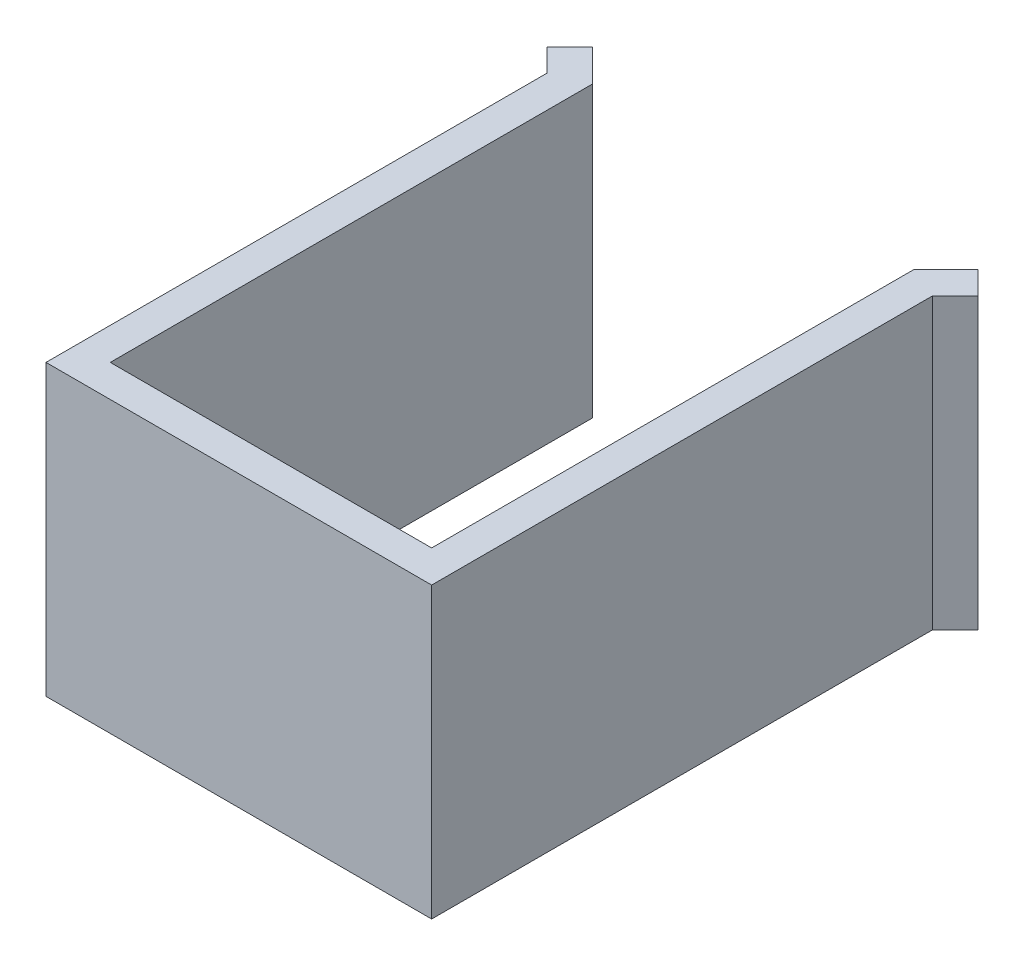
ISO-10303-21;
HEADER;
FILE_DESCRIPTION(('STEP AP214'),'2;1');
FILE_NAME('part.step','',(''),(''),'','','');
FILE_SCHEMA(('AUTOMOTIVE_DESIGN { 1 0 10303 214 1 1 1 1 }'));
ENDSEC;
DATA;
#1=APPLICATION_CONTEXT('core data for automotive mechanical design processes');
#2=APPLICATION_PROTOCOL_DEFINITION('international standard','automotive_design',2000,#1);
#3=PRODUCT_CONTEXT('',#1,'mechanical');
#4=PRODUCT('Part','Part','',(#3));
#5=PRODUCT_RELATED_PRODUCT_CATEGORY('part','',(#4));
#6=PRODUCT_DEFINITION_FORMATION('','',#4);
#7=PRODUCT_DEFINITION_CONTEXT('part definition',#1,'design');
#8=PRODUCT_DEFINITION('design','',#6,#7);
#9=PRODUCT_DEFINITION_SHAPE('','',#8);
#10=(LENGTH_UNIT() NAMED_UNIT(*) SI_UNIT(.MILLI.,.METRE.));
#11=(NAMED_UNIT(*) PLANE_ANGLE_UNIT() SI_UNIT($,.RADIAN.));
#12=(NAMED_UNIT(*) SI_UNIT($,.STERADIAN.) SOLID_ANGLE_UNIT());
#13=UNCERTAINTY_MEASURE_WITH_UNIT(LENGTH_MEASURE(1.E-05),#10,'distance_accuracy_value','');
#14=(GEOMETRIC_REPRESENTATION_CONTEXT(3) GLOBAL_UNCERTAINTY_ASSIGNED_CONTEXT((#13)) GLOBAL_UNIT_ASSIGNED_CONTEXT((#10,
#11,#12)) REPRESENTATION_CONTEXT('',''));
#15=CARTESIAN_POINT('',(0.,0.,0.));
#16=DIRECTION('',(0.,0.,1.));
#17=DIRECTION('',(1.,0.,0.));
#18=AXIS2_PLACEMENT_3D('',#15,#16,#17);
#19=CARTESIAN_POINT('',(57.0710678118655,90.,-142.928932188135));
#20=DIRECTION('',(-0.70710678118655,0.,-0.707106781186545));
#21=DIRECTION('',(-0.707106781186545,0.,0.70710678118655));
#22=AXIS2_PLACEMENT_3D('',#19,#20,#21);
#23=PLANE('',#22);
#24=DIRECTION('',(0.707106781186545,0.,-0.70710678118655));
#25=VECTOR('',#24,1.);
#26=CARTESIAN_POINT('',(57.0710678118655,0.,-142.928932188135));
#27=LINE('',#26,#25);
#28=CARTESIAN_POINT('',(60.,0.,-145.857864376269));
#29=VERTEX_POINT('',#28);
#30=CARTESIAN_POINT('',(67.0710678118655,0.,-152.928932188135));
#31=VERTEX_POINT('',#30);
#32=EDGE_CURVE('E155',#29,#31,#27,.T.);
#33=ORIENTED_EDGE('',*,*,#32,.T.);
#34=DIRECTION('',(0.,-1.,0.));
#35=VECTOR('',#34,1.);
#36=CARTESIAN_POINT('',(67.0710678118655,90.,-152.928932188135));
#37=LINE('',#36,#35);
#38=CARTESIAN_POINT('',(67.0710678118655,90.,-152.928932188135));
#39=VERTEX_POINT('',#38);
#40=EDGE_CURVE('E11',#39,#31,#37,.T.);
#41=ORIENTED_EDGE('',*,*,#40,.F.);
#42=DIRECTION('',(0.707106781186545,0.,-0.70710678118655));
#43=VECTOR('',#42,1.);
#44=CARTESIAN_POINT('',(57.0710678118655,90.,-142.928932188135));
#45=LINE('',#44,#43);
#46=CARTESIAN_POINT('',(60.,90.,-145.857864376269));
#47=VERTEX_POINT('',#46);
#48=EDGE_CURVE('E103',#47,#39,#45,.T.);
#49=ORIENTED_EDGE('',*,*,#48,.F.);
#50=DIRECTION('',(0.,-1.,0.));
#51=VECTOR('',#50,1.);
#52=CARTESIAN_POINT('',(60.,90.,-145.857864376269));
#53=LINE('',#52,#51);
#54=EDGE_CURVE('E151',#47,#29,#53,.T.);
#55=ORIENTED_EDGE('',*,*,#54,.T.);
#56=EDGE_LOOP('',(#33,#41,#49,#55));
#57=FACE_BOUND('',#56,.T.);
#58=ADVANCED_FACE('F35',(#57),#23,.F.);
#59=CARTESIAN_POINT('',(60.,90.,-160.));
#60=DIRECTION('',(0.707106781186545,0.,-0.70710678118655));
#61=DIRECTION('',(-0.70710678118655,0.,-0.707106781186545));
#62=AXIS2_PLACEMENT_3D('',#59,#60,#61);
#63=PLANE('',#62);
#64=DIRECTION('',(0.70710678118655,0.,0.707106781186545));
#65=VECTOR('',#64,1.);
#66=CARTESIAN_POINT('',(60.,0.,-160.));
#67=LINE('',#66,#65);
#68=CARTESIAN_POINT('',(60.,0.,-160.));
#69=VERTEX_POINT('',#68);
#70=EDGE_CURVE('E158',#69,#31,#67,.T.);
#71=ORIENTED_EDGE('',*,*,#70,.F.);
#72=DIRECTION('',(0.,-1.,0.));
#73=VECTOR('',#72,1.);
#74=CARTESIAN_POINT('',(60.,90.,-160.));
#75=LINE('',#74,#73);
#76=CARTESIAN_POINT('',(60.,90.,-160.));
#77=VERTEX_POINT('',#76);
#78=EDGE_CURVE('E43',#77,#69,#75,.T.);
#79=ORIENTED_EDGE('',*,*,#78,.F.);
#80=DIRECTION('',(0.70710678118655,0.,0.707106781186545));
#81=VECTOR('',#80,1.);
#82=CARTESIAN_POINT('',(60.,90.,-160.));
#83=LINE('',#82,#81);
#84=EDGE_CURVE('E220',#77,#39,#83,.T.);
#85=ORIENTED_EDGE('',*,*,#84,.T.);
#86=ORIENTED_EDGE('',*,*,#40,.T.);
#87=EDGE_LOOP('',(#71,#79,#85,#86));
#88=FACE_BOUND('',#87,.T.);
#89=ADVANCED_FACE('F207',(#88),#63,.T.);
#90=CARTESIAN_POINT('',(50.,90.,-150.));
#91=DIRECTION('',(-0.70710678118655,0.,-0.707106781186545));
#92=DIRECTION('',(-0.707106781186545,0.,0.70710678118655));
#93=AXIS2_PLACEMENT_3D('',#90,#91,#92);
#94=PLANE('',#93);
#95=DIRECTION('',(0.707106781186545,0.,-0.70710678118655));
#96=VECTOR('',#95,1.);
#97=CARTESIAN_POINT('',(50.,0.,-150.));
#98=LINE('',#97,#96);
#99=CARTESIAN_POINT('',(50.,0.,-150.));
#100=VERTEX_POINT('',#99);
#101=EDGE_CURVE('E161',#100,#69,#98,.T.);
#102=ORIENTED_EDGE('',*,*,#101,.F.);
#103=DIRECTION('',(0.,-1.,0.));
#104=VECTOR('',#103,1.);
#105=CARTESIAN_POINT('',(50.,90.,-150.));
#106=LINE('',#105,#104);
#107=CARTESIAN_POINT('',(50.,90.,-150.));
#108=VERTEX_POINT('',#107);
#109=EDGE_CURVE('E197',#108,#100,#106,.T.);
#110=ORIENTED_EDGE('',*,*,#109,.F.);
#111=DIRECTION('',(0.707106781186545,0.,-0.70710678118655));
#112=VECTOR('',#111,1.);
#113=CARTESIAN_POINT('',(50.,90.,-150.));
#114=LINE('',#113,#112);
#115=EDGE_CURVE('E204',#108,#77,#114,.T.);
#116=ORIENTED_EDGE('',*,*,#115,.T.);
#117=ORIENTED_EDGE('',*,*,#78,.T.);
#118=EDGE_LOOP('',(#102,#110,#116,#117));
#119=FACE_BOUND('',#118,.T.);
#120=ADVANCED_FACE('F202',(#119),#94,.T.);
#121=CARTESIAN_POINT('',(50.,90.,0.));
#122=DIRECTION('',(-1.,0.,0.));
#123=DIRECTION('',(0.,0.,1.));
#124=AXIS2_PLACEMENT_3D('',#121,#122,#123);
#125=PLANE('',#124);
#126=DIRECTION('',(0.,0.,-1.));
#127=VECTOR('',#126,1.);
#128=CARTESIAN_POINT('',(50.,0.,0.));
#129=LINE('',#128,#127);
#130=CARTESIAN_POINT('',(50.,0.,0.));
#131=VERTEX_POINT('',#130);
#132=EDGE_CURVE('E164',#131,#100,#129,.T.);
#133=ORIENTED_EDGE('',*,*,#132,.F.);
#134=DIRECTION('',(0.,-1.,0.));
#135=VECTOR('',#134,1.);
#136=CARTESIAN_POINT('',(50.,90.,0.));
#137=LINE('',#136,#135);
#138=CARTESIAN_POINT('',(50.,90.,0.));
#139=VERTEX_POINT('',#138);
#140=EDGE_CURVE('E195',#139,#131,#137,.T.);
#141=ORIENTED_EDGE('',*,*,#140,.F.);
#142=DIRECTION('',(0.,0.,-1.));
#143=VECTOR('',#142,1.);
#144=CARTESIAN_POINT('',(50.,90.,0.));
#145=LINE('',#144,#143);
#146=EDGE_CURVE('E217',#139,#108,#145,.T.);
#147=ORIENTED_EDGE('',*,*,#146,.T.);
#148=ORIENTED_EDGE('',*,*,#109,.T.);
#149=EDGE_LOOP('',(#133,#141,#147,#148));
#150=FACE_BOUND('',#149,.T.);
#151=ADVANCED_FACE('F214',(#150),#125,.T.);
#152=CARTESIAN_POINT('',(50.,90.,0.));
#153=DIRECTION('',(0.,0.,-1.));
#154=DIRECTION('',(-1.,0.,0.));
#155=AXIS2_PLACEMENT_3D('',#152,#153,#154);
#156=PLANE('',#155);
#157=DIRECTION('',(1.,0.,0.));
#158=VECTOR('',#157,1.);
#159=CARTESIAN_POINT('',(50.,0.,0.));
#160=LINE('',#159,#158);
#161=CARTESIAN_POINT('',(-50.,0.,0.));
#162=VERTEX_POINT('',#161);
#163=EDGE_CURVE('E167',#162,#131,#160,.T.);
#164=ORIENTED_EDGE('',*,*,#163,.F.);
#165=DIRECTION('',(0.,-1.,0.));
#166=VECTOR('',#165,1.);
#167=CARTESIAN_POINT('',(-50.,90.,0.));
#168=LINE('',#167,#166);
#169=CARTESIAN_POINT('',(-50.,90.,0.));
#170=VERTEX_POINT('',#169);
#171=EDGE_CURVE('E193',#170,#162,#168,.T.);
#172=ORIENTED_EDGE('',*,*,#171,.F.);
#173=DIRECTION('',(1.,0.,0.));
#174=VECTOR('',#173,1.);
#175=CARTESIAN_POINT('',(50.,90.,0.));
#176=LINE('',#175,#174);
#177=EDGE_CURVE('E222',#170,#139,#176,.T.);
#178=ORIENTED_EDGE('',*,*,#177,.T.);
#179=ORIENTED_EDGE('',*,*,#140,.T.);
#180=EDGE_LOOP('',(#164,#172,#178,#179));
#181=FACE_BOUND('',#180,.T.);
#182=ADVANCED_FACE('F322',(#181),#156,.T.);
#183=CARTESIAN_POINT('',(-50.,90.,0.));
#184=DIRECTION('',(1.,0.,0.));
#185=DIRECTION('',(0.,0.,-1.));
#186=AXIS2_PLACEMENT_3D('',#183,#184,#185);
#187=PLANE('',#186);
#188=DIRECTION('',(0.,0.,1.));
#189=VECTOR('',#188,1.);
#190=CARTESIAN_POINT('',(-50.,0.,0.));
#191=LINE('',#190,#189);
#192=CARTESIAN_POINT('',(-50.,0.,-150.));
#193=VERTEX_POINT('',#192);
#194=EDGE_CURVE('E170',#193,#162,#191,.T.);
#195=ORIENTED_EDGE('',*,*,#194,.F.);
#196=DIRECTION('',(0.,-1.,0.));
#197=VECTOR('',#196,1.);
#198=CARTESIAN_POINT('',(-50.,90.,-150.));
#199=LINE('',#198,#197);
#200=CARTESIAN_POINT('',(-50.,90.,-150.));
#201=VERTEX_POINT('',#200);
#202=EDGE_CURVE('E191',#201,#193,#199,.T.);
#203=ORIENTED_EDGE('',*,*,#202,.F.);
#204=DIRECTION('',(0.,0.,1.));
#205=VECTOR('',#204,1.);
#206=CARTESIAN_POINT('',(-50.,90.,0.));
#207=LINE('',#206,#205);
#208=EDGE_CURVE('E228',#201,#170,#207,.T.);
#209=ORIENTED_EDGE('',*,*,#208,.T.);
#210=ORIENTED_EDGE('',*,*,#171,.T.);
#211=EDGE_LOOP('',(#195,#203,#209,#210));
#212=FACE_BOUND('',#211,.T.);
#213=ADVANCED_FACE('F313',(#212),#187,.T.);
#214=CARTESIAN_POINT('',(-50.,90.,-150.));
#215=DIRECTION('',(0.70710678118655,0.,-0.707106781186545));
#216=DIRECTION('',(-0.707106781186545,0.,-0.70710678118655));
#217=AXIS2_PLACEMENT_3D('',#214,#215,#216);
#218=PLANE('',#217);
#219=DIRECTION('',(0.707106781186545,0.,0.70710678118655));
#220=VECTOR('',#219,1.);
#221=CARTESIAN_POINT('',(-50.,0.,-150.));
#222=LINE('',#221,#220);
#223=CARTESIAN_POINT('',(-60.,0.,-160.));
#224=VERTEX_POINT('',#223);
#225=EDGE_CURVE('E173',#224,#193,#222,.T.);
#226=ORIENTED_EDGE('',*,*,#225,.F.);
#227=DIRECTION('',(0.,-1.,0.));
#228=VECTOR('',#227,1.);
#229=CARTESIAN_POINT('',(-60.,90.,-160.));
#230=LINE('',#229,#228);
#231=CARTESIAN_POINT('',(-60.,90.,-160.));
#232=VERTEX_POINT('',#231);
#233=EDGE_CURVE('E189',#232,#224,#230,.T.);
#234=ORIENTED_EDGE('',*,*,#233,.F.);
#235=DIRECTION('',(0.707106781186545,0.,0.70710678118655));
#236=VECTOR('',#235,1.);
#237=CARTESIAN_POINT('',(-50.,90.,-150.));
#238=LINE('',#237,#236);
#239=EDGE_CURVE('E231',#232,#201,#238,.T.);
#240=ORIENTED_EDGE('',*,*,#239,.T.);
#241=ORIENTED_EDGE('',*,*,#202,.T.);
#242=EDGE_LOOP('',(#226,#234,#240,#241));
#243=FACE_BOUND('',#242,.T.);
#244=ADVANCED_FACE('F243',(#243),#218,.T.);
#245=CARTESIAN_POINT('',(-67.0710678118655,90.,-152.928932188135));
#246=DIRECTION('',(-0.707106781186545,0.,-0.70710678118655));
#247=DIRECTION('',(-0.70710678118655,0.,0.707106781186545));
#248=AXIS2_PLACEMENT_3D('',#245,#246,#247);
#249=PLANE('',#248);
#250=DIRECTION('',(0.70710678118655,0.,-0.707106781186545));
#251=VECTOR('',#250,1.);
#252=CARTESIAN_POINT('',(-67.0710678118655,0.,-152.928932188135));
#253=LINE('',#252,#251);
#254=CARTESIAN_POINT('',(-67.0710678118655,0.,-152.928932188135));
#255=VERTEX_POINT('',#254);
#256=EDGE_CURVE('E176',#255,#224,#253,.T.);
#257=ORIENTED_EDGE('',*,*,#256,.F.);
#258=DIRECTION('',(0.,-1.,0.));
#259=VECTOR('',#258,1.);
#260=CARTESIAN_POINT('',(-67.0710678118655,90.,-152.928932188135));
#261=LINE('',#260,#259);
#262=CARTESIAN_POINT('',(-67.0710678118655,90.,-152.928932188135));
#263=VERTEX_POINT('',#262);
#264=EDGE_CURVE('E187',#263,#255,#261,.T.);
#265=ORIENTED_EDGE('',*,*,#264,.F.);
#266=DIRECTION('',(0.70710678118655,0.,-0.707106781186545));
#267=VECTOR('',#266,1.);
#268=CARTESIAN_POINT('',(-67.0710678118655,90.,-152.928932188135));
#269=LINE('',#268,#267);
#270=EDGE_CURVE('E234',#263,#232,#269,.T.);
#271=ORIENTED_EDGE('',*,*,#270,.T.);
#272=ORIENTED_EDGE('',*,*,#233,.T.);
#273=EDGE_LOOP('',(#257,#265,#271,#272));
#274=FACE_BOUND('',#273,.T.);
#275=ADVANCED_FACE('F238',(#274),#249,.T.);
#276=CARTESIAN_POINT('',(-57.0710678118655,90.,-142.928932188135));
#277=DIRECTION('',(0.70710678118655,0.,-0.707106781186545));
#278=DIRECTION('',(-0.707106781186545,0.,-0.70710678118655));
#279=AXIS2_PLACEMENT_3D('',#276,#277,#278);
#280=PLANE('',#279);
#281=DIRECTION('',(0.707106781186545,0.,0.70710678118655));
#282=VECTOR('',#281,1.);
#283=CARTESIAN_POINT('',(-57.0710678118655,0.,-142.928932188135));
#284=LINE('',#283,#282);
#285=CARTESIAN_POINT('',(-60.,0.,-145.857864376269));
#286=VERTEX_POINT('',#285);
#287=EDGE_CURVE('E179',#255,#286,#284,.T.);
#288=ORIENTED_EDGE('',*,*,#287,.T.);
#289=DIRECTION('',(0.,-1.,0.));
#290=VECTOR('',#289,1.);
#291=CARTESIAN_POINT('',(-60.,90.,-145.857864376269));
#292=LINE('',#291,#290);
#293=CARTESIAN_POINT('',(-60.,90.,-145.857864376269));
#294=VERTEX_POINT('',#293);
#295=EDGE_CURVE('E146',#294,#286,#292,.T.);
#296=ORIENTED_EDGE('',*,*,#295,.F.);
#297=DIRECTION('',(0.707106781186545,0.,0.70710678118655));
#298=VECTOR('',#297,1.);
#299=CARTESIAN_POINT('',(-57.0710678118655,90.,-142.928932188135));
#300=LINE('',#299,#298);
#301=EDGE_CURVE('E137',#263,#294,#300,.T.);
#302=ORIENTED_EDGE('',*,*,#301,.F.);
#303=ORIENTED_EDGE('',*,*,#264,.T.);
#304=EDGE_LOOP('',(#288,#296,#302,#303));
#305=FACE_BOUND('',#304,.T.);
#306=ADVANCED_FACE('F247',(#305),#280,.F.);
#307=CARTESIAN_POINT('',(-60.,90.,0.));
#308=DIRECTION('',(1.,0.,0.));
#309=DIRECTION('',(0.,0.,-1.));
#310=AXIS2_PLACEMENT_3D('',#307,#308,#309);
#311=PLANE('',#310);
#312=DIRECTION('',(0.,0.,-1.));
#313=VECTOR('',#312,1.);
#314=CARTESIAN_POINT('',(-60.,0.,0.));
#315=LINE('',#314,#313);
#316=CARTESIAN_POINT('',(-60.,0.,10.));
#317=VERTEX_POINT('',#316);
#318=EDGE_CURVE('E145',#286,#317,#315,.F.);
#319=ORIENTED_EDGE('',*,*,#318,.T.);
#320=DIRECTION('',(0.,-1.,0.));
#321=VECTOR('',#320,1.);
#322=CARTESIAN_POINT('',(-60.,90.,10.));
#323=LINE('',#322,#321);
#324=CARTESIAN_POINT('',(-60.,90.,10.));
#325=VERTEX_POINT('',#324);
#326=EDGE_CURVE('E142',#325,#317,#323,.T.);
#327=ORIENTED_EDGE('',*,*,#326,.F.);
#328=DIRECTION('',(0.,0.,-1.));
#329=VECTOR('',#328,1.);
#330=CARTESIAN_POINT('',(-60.,90.,0.));
#331=LINE('',#330,#329);
#332=EDGE_CURVE('E130',#294,#325,#331,.F.);
#333=ORIENTED_EDGE('',*,*,#332,.F.);
#334=ORIENTED_EDGE('',*,*,#295,.T.);
#335=EDGE_LOOP('',(#319,#327,#333,#334));
#336=FACE_BOUND('',#335,.T.);
#337=ADVANCED_FACE('F143',(#336),#311,.F.);
#338=CARTESIAN_POINT('',(50.,90.,10.));
#339=DIRECTION('',(0.,0.,-1.));
#340=DIRECTION('',(-1.,0.,0.));
#341=AXIS2_PLACEMENT_3D('',#338,#339,#340);
#342=PLANE('',#341);
#343=DIRECTION('',(1.,0.,0.));
#344=VECTOR('',#343,1.);
#345=CARTESIAN_POINT('',(50.,0.,10.));
#346=LINE('',#345,#344);
#347=CARTESIAN_POINT('',(60.,0.,10.));
#348=VERTEX_POINT('',#347);
#349=EDGE_CURVE('E91',#317,#348,#346,.T.);
#350=ORIENTED_EDGE('',*,*,#349,.T.);
#351=DIRECTION('',(0.,-1.,0.));
#352=VECTOR('',#351,1.);
#353=CARTESIAN_POINT('',(60.,90.,10.));
#354=LINE('',#353,#352);
#355=CARTESIAN_POINT('',(60.,90.,10.));
#356=VERTEX_POINT('',#355);
#357=EDGE_CURVE('E147',#356,#348,#354,.T.);
#358=ORIENTED_EDGE('',*,*,#357,.F.);
#359=DIRECTION('',(1.,0.,0.));
#360=VECTOR('',#359,1.);
#361=CARTESIAN_POINT('',(50.,90.,10.));
#362=LINE('',#361,#360);
#363=EDGE_CURVE('E134',#325,#356,#362,.T.);
#364=ORIENTED_EDGE('',*,*,#363,.F.);
#365=ORIENTED_EDGE('',*,*,#326,.T.);
#366=EDGE_LOOP('',(#350,#358,#364,#365));
#367=FACE_BOUND('',#366,.T.);
#368=ADVANCED_FACE('F149',(#367),#342,.F.);
#369=CARTESIAN_POINT('',(60.,90.,0.));
#370=DIRECTION('',(-1.,0.,0.));
#371=DIRECTION('',(0.,0.,1.));
#372=AXIS2_PLACEMENT_3D('',#369,#370,#371);
#373=PLANE('',#372);
#374=DIRECTION('',(0.,0.,-1.));
#375=VECTOR('',#374,1.);
#376=CARTESIAN_POINT('',(60.,0.,0.));
#377=LINE('',#376,#375);
#378=EDGE_CURVE('E97',#348,#29,#377,.T.);
#379=ORIENTED_EDGE('',*,*,#378,.T.);
#380=ORIENTED_EDGE('',*,*,#54,.F.);
#381=DIRECTION('',(0.,0.,-1.));
#382=VECTOR('',#381,1.);
#383=CARTESIAN_POINT('',(60.,90.,0.));
#384=LINE('',#383,#382);
#385=EDGE_CURVE('E51',#356,#47,#384,.T.);
#386=ORIENTED_EDGE('',*,*,#385,.F.);
#387=ORIENTED_EDGE('',*,*,#357,.T.);
#388=EDGE_LOOP('',(#379,#380,#386,#387));
#389=FACE_BOUND('',#388,.T.);
#390=ADVANCED_FACE('F261',(#389),#373,.F.);
#391=CARTESIAN_POINT('',(0.,90.,0.));
#392=DIRECTION('',(0.,-1.,0.));
#393=DIRECTION('',(-1.,0.,0.));
#394=AXIS2_PLACEMENT_3D('',#391,#392,#393);
#395=PLANE('',#394);
#396=ORIENTED_EDGE('',*,*,#48,.T.);
#397=ORIENTED_EDGE('',*,*,#84,.F.);
#398=ORIENTED_EDGE('',*,*,#115,.F.);
#399=ORIENTED_EDGE('',*,*,#146,.F.);
#400=ORIENTED_EDGE('',*,*,#177,.F.);
#401=ORIENTED_EDGE('',*,*,#208,.F.);
#402=ORIENTED_EDGE('',*,*,#239,.F.);
#403=ORIENTED_EDGE('',*,*,#270,.F.);
#404=ORIENTED_EDGE('',*,*,#301,.T.);
#405=ORIENTED_EDGE('',*,*,#332,.T.);
#406=ORIENTED_EDGE('',*,*,#363,.T.);
#407=ORIENTED_EDGE('',*,*,#385,.T.);
#408=EDGE_LOOP('',(#396,#397,#398,#399,#400,#401,#402,#403,#404,#405,#406,#407));
#409=FACE_BOUND('',#408,.T.);
#410=ADVANCED_FACE('F132',(#409),#395,.F.);
#411=CARTESIAN_POINT('',(0.,0.,0.));
#412=DIRECTION('',(0.,-1.,0.));
#413=DIRECTION('',(-1.,0.,0.));
#414=AXIS2_PLACEMENT_3D('',#411,#412,#413);
#415=PLANE('',#414);
#416=ORIENTED_EDGE('',*,*,#32,.F.);
#417=ORIENTED_EDGE('',*,*,#378,.F.);
#418=ORIENTED_EDGE('',*,*,#349,.F.);
#419=ORIENTED_EDGE('',*,*,#318,.F.);
#420=ORIENTED_EDGE('',*,*,#287,.F.);
#421=ORIENTED_EDGE('',*,*,#256,.T.);
#422=ORIENTED_EDGE('',*,*,#225,.T.);
#423=ORIENTED_EDGE('',*,*,#194,.T.);
#424=ORIENTED_EDGE('',*,*,#163,.T.);
#425=ORIENTED_EDGE('',*,*,#132,.T.);
#426=ORIENTED_EDGE('',*,*,#101,.T.);
#427=ORIENTED_EDGE('',*,*,#70,.T.);
#428=EDGE_LOOP('',(#416,#417,#418,#419,#420,#421,#422,#423,#424,#425,#426,#427));
#429=FACE_BOUND('',#428,.T.);
#430=ADVANCED_FACE('F210',(#429),#415,.T.);
#431=CLOSED_SHELL('',(#58,#89,#120,#151,#182,#213,#244,#275,#306,#337,#368,#390,#410,#430));
#432=MANIFOLD_SOLID_BREP('B2',#431);
#433=ADVANCED_BREP_SHAPE_REPRESENTATION('',(#18,#432),#14);
#434=SHAPE_DEFINITION_REPRESENTATION(#9,#433);
ENDSEC;
END-ISO-10303-21;
